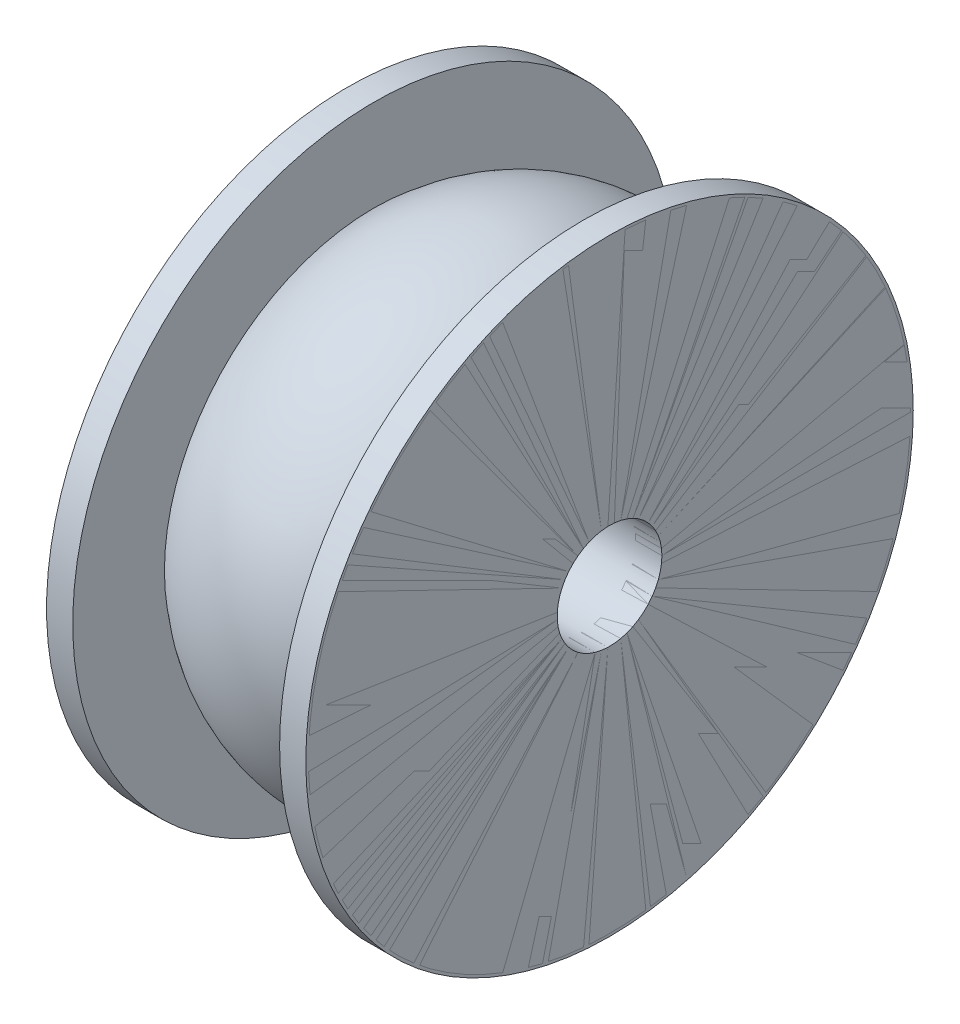
ISO-10303-21;
HEADER;
FILE_DESCRIPTION(('STEP AP214'),'2;1');
FILE_NAME('part.step','',(''),(''),'','','');
FILE_SCHEMA(('AUTOMOTIVE_DESIGN { 1 0 10303 214 1 1 1 1 }'));
ENDSEC;
DATA;
#1=APPLICATION_CONTEXT('core data for automotive mechanical design processes');
#2=APPLICATION_PROTOCOL_DEFINITION('international standard','automotive_design',2000,#1);
#3=PRODUCT_CONTEXT('',#1,'mechanical');
#4=PRODUCT('Part','Part','',(#3));
#5=PRODUCT_RELATED_PRODUCT_CATEGORY('part','',(#4));
#6=PRODUCT_DEFINITION_FORMATION('','',#4);
#7=PRODUCT_DEFINITION_CONTEXT('part definition',#1,'design');
#8=PRODUCT_DEFINITION('design','',#6,#7);
#9=PRODUCT_DEFINITION_SHAPE('','',#8);
#10=(LENGTH_UNIT() NAMED_UNIT(*) SI_UNIT(.MILLI.,.METRE.));
#11=(NAMED_UNIT(*) PLANE_ANGLE_UNIT() SI_UNIT($,.RADIAN.));
#12=(NAMED_UNIT(*) SI_UNIT($,.STERADIAN.) SOLID_ANGLE_UNIT());
#13=UNCERTAINTY_MEASURE_WITH_UNIT(LENGTH_MEASURE(1.E-05),#10,'distance_accuracy_value','');
#14=(GEOMETRIC_REPRESENTATION_CONTEXT(3) GLOBAL_UNCERTAINTY_ASSIGNED_CONTEXT((#13)) GLOBAL_UNIT_ASSIGNED_CONTEXT((#10,
#11,#12)) REPRESENTATION_CONTEXT('',''));
#15=CARTESIAN_POINT('',(0.,0.,0.));
#16=DIRECTION('',(0.,0.,1.));
#17=DIRECTION('',(1.,0.,0.));
#18=AXIS2_PLACEMENT_3D('',#15,#16,#17);
#19=CARTESIAN_POINT('',(4.5,0.,0.));
#20=DIRECTION('',(-1.,0.,0.));
#21=DIRECTION('',(0.,0.,1.));
#22=AXIS2_PLACEMENT_3D('',#19,#20,#21);
#23=CYLINDRICAL_SURFACE('',#22,5.8);
#24=CARTESIAN_POINT('',(4.5,0.,0.));
#25=DIRECTION('',(1.,0.,0.));
#26=DIRECTION('',(0.,0.,-1.));
#27=AXIS2_PLACEMENT_3D('',#24,#25,#26);
#28=CIRCLE('',#27,5.8);
#29=CARTESIAN_POINT('',(4.5,0.,-5.8));
#30=VERTEX_POINT('',#29);
#31=EDGE_CURVE('E11',#30,#30,#28,.T.);
#32=ORIENTED_EDGE('',*,*,#31,.F.);
#33=EDGE_LOOP('',(#32));
#34=FACE_BOUND('',#33,.T.);
#35=CARTESIAN_POINT('',(4.,0.,0.));
#36=DIRECTION('',(1.,0.,0.));
#37=DIRECTION('',(0.,0.,-1.));
#38=AXIS2_PLACEMENT_3D('',#35,#36,#37);
#39=CIRCLE('',#38,5.8);
#40=CARTESIAN_POINT('',(4.,0.,-5.8));
#41=VERTEX_POINT('',#40);
#42=EDGE_CURVE('E50',#41,#41,#39,.T.);
#43=ORIENTED_EDGE('',*,*,#42,.T.);
#44=EDGE_LOOP('',(#43));
#45=FACE_BOUND('',#44,.T.);
#46=ADVANCED_FACE('F43',(#34,#45),#23,.T.);
#47=CARTESIAN_POINT('',(4.5,0.,0.));
#48=DIRECTION('',(1.,0.,0.));
#49=DIRECTION('',(0.,0.,-1.));
#50=AXIS2_PLACEMENT_3D('',#47,#48,#49);
#51=PLANE('',#50);
#52=CARTESIAN_POINT('',(4.5,0.,0.));
#53=DIRECTION('',(1.,0.,0.));
#54=DIRECTION('',(0.,0.,-1.));
#55=AXIS2_PLACEMENT_3D('',#52,#53,#54);
#56=CIRCLE('',#55,1.);
#57=CARTESIAN_POINT('',(4.5,0.,-1.));
#58=VERTEX_POINT('',#57);
#59=EDGE_CURVE('E56',#58,#58,#56,.T.);
#60=ORIENTED_EDGE('',*,*,#59,.F.);
#61=EDGE_LOOP('',(#60));
#62=FACE_BOUND('',#61,.T.);
#63=ORIENTED_EDGE('',*,*,#31,.T.);
#64=EDGE_LOOP('',(#63));
#65=FACE_BOUND('',#64,.T.);
#66=ADVANCED_FACE('F72',(#62,#65),#51,.T.);
#67=CARTESIAN_POINT('',(4.,0.,0.));
#68=DIRECTION('',(1.,0.,0.));
#69=DIRECTION('',(0.,0.,-1.));
#70=AXIS2_PLACEMENT_3D('',#67,#68,#69);
#71=PLANE('',#70);
#72=CARTESIAN_POINT('',(4.,0.,0.));
#73=DIRECTION('',(1.,0.,0.));
#74=DIRECTION('',(0.,0.,-1.));
#75=AXIS2_PLACEMENT_3D('',#72,#73,#74);
#76=CIRCLE('',#75,1.);
#77=CARTESIAN_POINT('',(4.,0.,-1.));
#78=VERTEX_POINT('',#77);
#79=EDGE_CURVE('E46',#78,#78,#76,.T.);
#80=ORIENTED_EDGE('',*,*,#79,.T.);
#81=EDGE_LOOP('',(#80));
#82=FACE_BOUND('',#81,.T.);
#83=ORIENTED_EDGE('',*,*,#42,.F.);
#84=EDGE_LOOP('',(#83));
#85=FACE_BOUND('',#84,.T.);
#86=ADVANCED_FACE('F63',(#82,#85),#71,.F.);
#87=CARTESIAN_POINT('',(-0.5,0.,0.));
#88=DIRECTION('',(1.,0.,0.));
#89=DIRECTION('',(0.,0.,-1.));
#90=AXIS2_PLACEMENT_3D('',#87,#88,#89);
#91=CYLINDRICAL_SURFACE('',#90,1.);
#92=ORIENTED_EDGE('',*,*,#59,.T.);
#93=EDGE_LOOP('',(#92));
#94=FACE_BOUND('',#93,.T.);
#95=ORIENTED_EDGE('',*,*,#79,.F.);
#96=EDGE_LOOP('',(#95));
#97=FACE_BOUND('',#96,.T.);
#98=ADVANCED_FACE('F66',(#94,#97),#91,.F.);
#99=CLOSED_SHELL('',(#46,#66,#86,#98));
#100=MANIFOLD_SOLID_BREP('B2',#99);
#101=CARTESIAN_POINT('',(-0.5,0.,0.));
#102=DIRECTION('',(1.,0.,0.));
#103=DIRECTION('',(0.,0.,-1.));
#104=AXIS2_PLACEMENT_3D('',#101,#102,#103);
#105=CYLINDRICAL_SURFACE('',#104,5.75);
#106=CARTESIAN_POINT('',(-0.5,0.,0.));
#107=DIRECTION('',(1.,0.,0.));
#108=DIRECTION('',(0.,0.,-1.));
#109=AXIS2_PLACEMENT_3D('',#106,#107,#108);
#110=CIRCLE('',#109,5.75);
#111=CARTESIAN_POINT('',(-0.5,0.,-5.75));
#112=VERTEX_POINT('',#111);
#113=EDGE_CURVE('E111',#112,#112,#110,.T.);
#114=ORIENTED_EDGE('',*,*,#113,.T.);
#115=EDGE_LOOP('',(#114));
#116=FACE_BOUND('',#115,.T.);
#117=CARTESIAN_POINT('',(0.,0.,0.));
#118=DIRECTION('',(1.,0.,0.));
#119=DIRECTION('',(0.,0.,-1.));
#120=AXIS2_PLACEMENT_3D('',#117,#118,#119);
#121=CIRCLE('',#120,5.75);
#122=CARTESIAN_POINT('',(0.,0.,-5.75));
#123=VERTEX_POINT('',#122);
#124=EDGE_CURVE('E115',#123,#123,#121,.T.);
#125=ORIENTED_EDGE('',*,*,#124,.F.);
#126=EDGE_LOOP('',(#125));
#127=FACE_BOUND('',#126,.T.);
#128=ADVANCED_FACE('F105',(#116,#127),#105,.T.);
#129=CARTESIAN_POINT('',(-0.5,0.,0.));
#130=DIRECTION('',(1.,0.,0.));
#131=DIRECTION('',(0.,0.,-1.));
#132=AXIS2_PLACEMENT_3D('',#129,#130,#131);
#133=PLANE('',#132);
#134=CARTESIAN_POINT('',(-0.5,0.,0.));
#135=DIRECTION('',(1.,0.,0.));
#136=DIRECTION('',(0.,0.,-1.));
#137=AXIS2_PLACEMENT_3D('',#134,#135,#136);
#138=CIRCLE('',#137,1.);
#139=CARTESIAN_POINT('',(-0.5,0.,-1.));
#140=VERTEX_POINT('',#139);
#141=EDGE_CURVE('E128',#140,#140,#138,.T.);
#142=ORIENTED_EDGE('',*,*,#141,.T.);
#143=EDGE_LOOP('',(#142));
#144=FACE_BOUND('',#143,.T.);
#145=ORIENTED_EDGE('',*,*,#113,.F.);
#146=EDGE_LOOP('',(#145));
#147=FACE_BOUND('',#146,.T.);
#148=ADVANCED_FACE('F137',(#144,#147),#133,.F.);
#149=CARTESIAN_POINT('',(0.,0.,0.));
#150=DIRECTION('',(1.,0.,0.));
#151=DIRECTION('',(0.,0.,-1.));
#152=AXIS2_PLACEMENT_3D('',#149,#150,#151);
#153=PLANE('',#152);
#154=CARTESIAN_POINT('',(0.,0.,0.));
#155=DIRECTION('',(1.,0.,0.));
#156=DIRECTION('',(0.,0.,-1.));
#157=AXIS2_PLACEMENT_3D('',#154,#155,#156);
#158=CIRCLE('',#157,3.99925416274178);
#159=CARTESIAN_POINT('',(0.,0.,-3.99925416274178));
#160=VERTEX_POINT('',#159);
#161=EDGE_CURVE('E42',#160,#160,#158,.T.);
#162=ORIENTED_EDGE('',*,*,#161,.F.);
#163=EDGE_LOOP('',(#162));
#164=FACE_BOUND('',#163,.T.);
#165=ORIENTED_EDGE('',*,*,#124,.T.);
#166=EDGE_LOOP('',(#165));
#167=FACE_BOUND('',#166,.T.);
#168=ADVANCED_FACE('F169',(#164,#167),#153,.T.);
#169=CARTESIAN_POINT('',(2.,0.,0.));
#170=DIRECTION('',(-1.,0.,0.));
#171=DIRECTION('',(0.,0.,1.));
#172=AXIS2_PLACEMENT_3D('',#169,#170,#171);
#173=DEGENERATE_TOROIDAL_SURFACE('',#172,1.76318618524199,3.,.T.);
#174=CARTESIAN_POINT('',(4.,0.,0.));
#175=DIRECTION('',(-1.,0.,0.));
#176=DIRECTION('',(0.,0.,1.));
#177=AXIS2_PLACEMENT_3D('',#174,#175,#176);
#178=CIRCLE('',#177,3.99925416274178);
#179=CARTESIAN_POINT('',(4.,0.,3.99925416274178));
#180=VERTEX_POINT('',#179);
#181=EDGE_CURVE('E120',#180,#180,#178,.F.);
#182=ORIENTED_EDGE('',*,*,#181,.F.);
#183=EDGE_LOOP('',(#182));
#184=FACE_BOUND('',#183,.T.);
#185=ORIENTED_EDGE('',*,*,#161,.T.);
#186=EDGE_LOOP('',(#185));
#187=FACE_BOUND('',#186,.T.);
#188=ADVANCED_FACE('F156',(#184,#187),#173,.T.);
#189=CARTESIAN_POINT('',(4.5,0.,0.));
#190=DIRECTION('',(-1.,0.,0.));
#191=DIRECTION('',(0.,0.,1.));
#192=AXIS2_PLACEMENT_3D('',#189,#190,#191);
#193=CYLINDRICAL_SURFACE('',#192,5.75);
#194=CARTESIAN_POINT('',(4.5,0.,0.));
#195=DIRECTION('',(1.,0.,0.));
#196=DIRECTION('',(0.,0.,-1.));
#197=AXIS2_PLACEMENT_3D('',#194,#195,#196);
#198=CIRCLE('',#197,5.75);
#199=CARTESIAN_POINT('',(4.5,0.,-5.75));
#200=VERTEX_POINT('',#199);
#201=EDGE_CURVE('E124',#200,#200,#198,.T.);
#202=ORIENTED_EDGE('',*,*,#201,.F.);
#203=EDGE_LOOP('',(#202));
#204=FACE_BOUND('',#203,.T.);
#205=CARTESIAN_POINT('',(4.,0.,0.));
#206=DIRECTION('',(1.,0.,0.));
#207=DIRECTION('',(0.,0.,-1.));
#208=AXIS2_PLACEMENT_3D('',#205,#206,#207);
#209=CIRCLE('',#208,5.75);
#210=CARTESIAN_POINT('',(4.,0.,-5.75));
#211=VERTEX_POINT('',#210);
#212=EDGE_CURVE('E125',#211,#211,#209,.T.);
#213=ORIENTED_EDGE('',*,*,#212,.T.);
#214=EDGE_LOOP('',(#213));
#215=FACE_BOUND('',#214,.T.);
#216=ADVANCED_FACE('F150',(#204,#215),#193,.T.);
#217=CARTESIAN_POINT('',(4.5,0.,0.));
#218=DIRECTION('',(-1.,0.,0.));
#219=DIRECTION('',(0.,0.,-1.));
#220=AXIS2_PLACEMENT_3D('',#217,#218,#219);
#221=PLANE('',#220);
#222=CARTESIAN_POINT('',(4.5,0.,0.));
#223=DIRECTION('',(1.,0.,0.));
#224=DIRECTION('',(0.,0.,-1.));
#225=AXIS2_PLACEMENT_3D('',#222,#223,#224);
#226=CIRCLE('',#225,1.);
#227=CARTESIAN_POINT('',(4.5,0.,-1.));
#228=VERTEX_POINT('',#227);
#229=EDGE_CURVE('E131',#228,#228,#226,.T.);
#230=ORIENTED_EDGE('',*,*,#229,.F.);
#231=EDGE_LOOP('',(#230));
#232=FACE_BOUND('',#231,.T.);
#233=ORIENTED_EDGE('',*,*,#201,.T.);
#234=EDGE_LOOP('',(#233));
#235=FACE_BOUND('',#234,.T.);
#236=ADVANCED_FACE('F147',(#232,#235),#221,.F.);
#237=CARTESIAN_POINT('',(4.,0.,0.));
#238=DIRECTION('',(-1.,0.,0.));
#239=DIRECTION('',(0.,0.,-1.));
#240=AXIS2_PLACEMENT_3D('',#237,#238,#239);
#241=PLANE('',#240);
#242=ORIENTED_EDGE('',*,*,#181,.T.);
#243=EDGE_LOOP('',(#242));
#244=FACE_BOUND('',#243,.T.);
#245=ORIENTED_EDGE('',*,*,#212,.F.);
#246=EDGE_LOOP('',(#245));
#247=FACE_BOUND('',#246,.T.);
#248=ADVANCED_FACE('F143',(#244,#247),#241,.T.);
#249=CARTESIAN_POINT('',(0.,0.,0.));
#250=DIRECTION('',(-1.,0.,0.));
#251=DIRECTION('',(0.,0.,1.));
#252=AXIS2_PLACEMENT_3D('',#249,#250,#251);
#253=CYLINDRICAL_SURFACE('',#252,1.);
#254=ORIENTED_EDGE('',*,*,#141,.F.);
#255=EDGE_LOOP('',(#254));
#256=FACE_BOUND('',#255,.T.);
#257=ORIENTED_EDGE('',*,*,#229,.T.);
#258=EDGE_LOOP('',(#257));
#259=FACE_BOUND('',#258,.T.);
#260=ADVANCED_FACE('F140',(#256,#259),#253,.F.);
#261=CLOSED_SHELL('',(#128,#148,#168,#188,#216,#236,#248,#260));
#262=MANIFOLD_SOLID_BREP('B6',#261);
#263=ADVANCED_BREP_SHAPE_REPRESENTATION('',(#18,#100,#262),#14);
#264=SHAPE_DEFINITION_REPRESENTATION(#9,#263);
ENDSEC;
END-ISO-10303-21;
